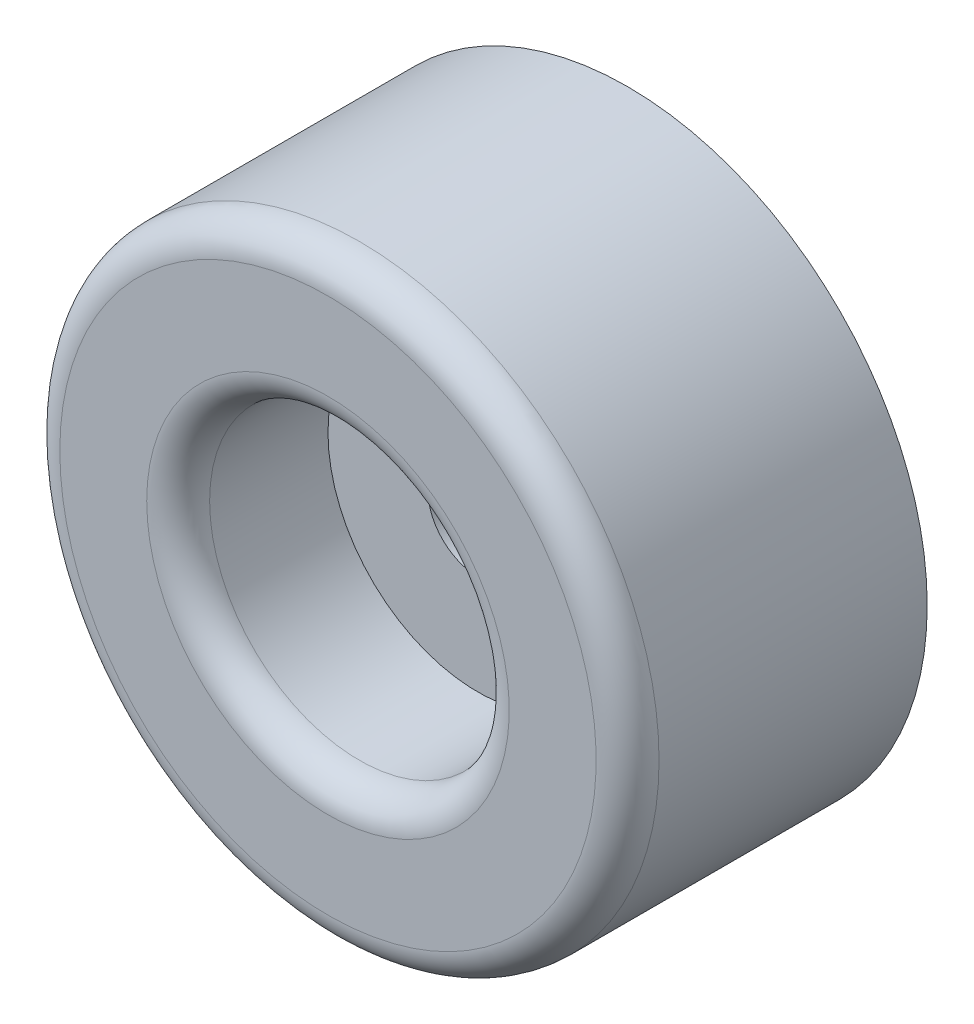
ISO-10303-21;
HEADER;
FILE_DESCRIPTION(('STEP AP214'),'2;1');
FILE_NAME('part.step','',(''),(''),'','','');
FILE_SCHEMA(('AUTOMOTIVE_DESIGN { 1 0 10303 214 1 1 1 1 }'));
ENDSEC;
DATA;
#1=APPLICATION_CONTEXT('core data for automotive mechanical design processes');
#2=APPLICATION_PROTOCOL_DEFINITION('international standard','automotive_design',2000,#1);
#3=PRODUCT_CONTEXT('',#1,'mechanical');
#4=PRODUCT('Part','Part','',(#3));
#5=PRODUCT_RELATED_PRODUCT_CATEGORY('part','',(#4));
#6=PRODUCT_DEFINITION_FORMATION('','',#4);
#7=PRODUCT_DEFINITION_CONTEXT('part definition',#1,'design');
#8=PRODUCT_DEFINITION('design','',#6,#7);
#9=PRODUCT_DEFINITION_SHAPE('','',#8);
#10=(LENGTH_UNIT() NAMED_UNIT(*) SI_UNIT(.MILLI.,.METRE.));
#11=(NAMED_UNIT(*) PLANE_ANGLE_UNIT() SI_UNIT($,.RADIAN.));
#12=(NAMED_UNIT(*) SI_UNIT($,.STERADIAN.) SOLID_ANGLE_UNIT());
#13=UNCERTAINTY_MEASURE_WITH_UNIT(LENGTH_MEASURE(1.E-05),#10,'distance_accuracy_value','');
#14=(GEOMETRIC_REPRESENTATION_CONTEXT(3) GLOBAL_UNCERTAINTY_ASSIGNED_CONTEXT((#13)) GLOBAL_UNIT_ASSIGNED_CONTEXT((#10,
#11,#12)) REPRESENTATION_CONTEXT('',''));
#15=CARTESIAN_POINT('',(0.,0.,0.));
#16=DIRECTION('',(0.,0.,1.));
#17=DIRECTION('',(1.,0.,0.));
#18=AXIS2_PLACEMENT_3D('',#15,#16,#17);
#19=CARTESIAN_POINT('',(0.,0.,13.1472968453585));
#20=DIRECTION('',(0.,0.,1.));
#21=DIRECTION('',(1.00000000000005,0.,0.));
#22=AXIS2_PLACEMENT_3D('',#19,#20,#21);
#23=CYLINDRICAL_SURFACE('',#22,19.05);
#24=CARTESIAN_POINT('',(0.,0.,17.0499999999997));
#25=DIRECTION('',(0.,0.,-1.));
#26=DIRECTION('',(-1.00000000000005,0.,0.));
#27=AXIS2_PLACEMENT_3D('',#24,#25,#26);
#28=CIRCLE('',#27,19.05);
#29=CARTESIAN_POINT('',(19.050000000001,-3.07803990858155E-13,17.0499999999997));
#30=VERTEX_POINT('',#29);
#31=EDGE_CURVE('E12',#30,#30,#28,.T.);
#32=CARTESIAN_POINT('',(0.,0.,0.));
#33=DIRECTION('',(0.,0.,1.));
#34=DIRECTION('',(1.00000000000005,0.,0.));
#35=AXIS2_PLACEMENT_3D('',#32,#33,#34);
#36=CIRCLE('',#35,19.05);
#37=CARTESIAN_POINT('',(19.050000000001,-3.02855768816391E-13,0.));
#38=VERTEX_POINT('',#37);
#39=EDGE_CURVE('E77',#38,#38,#36,.T.);
#40=CARTESIAN_POINT('',(19.050000000001,-3.07803990858155E-13,17.0499999999997));
#41=CARTESIAN_POINT('',(19.050000000001,-3.07752446878553E-13,16.872395833333));
#42=CARTESIAN_POINT('',(19.050000000001,-3.07700902898951E-13,16.6947916666664));
#43=CARTESIAN_POINT('',(19.050000000001,-3.07597814939748E-13,16.339583333333));
#44=CARTESIAN_POINT('',(19.050000000001,-3.07546270960146E-13,16.1619791666664));
#45=CARTESIAN_POINT('',(19.050000000001,-3.07443183000943E-13,15.806770833333));
#46=CARTESIAN_POINT('',(19.050000000001,-3.07391639021341E-13,15.6291666666664));
#47=CARTESIAN_POINT('',(19.050000000001,-3.07288551062137E-13,15.273958333333));
#48=CARTESIAN_POINT('',(19.050000000001,-3.07237007082536E-13,15.0963541666664));
#49=CARTESIAN_POINT('',(19.050000000001,-3.07133919123332E-13,14.7411458333331));
#50=CARTESIAN_POINT('',(19.050000000001,-3.07082375143731E-13,14.5635416666664));
#51=CARTESIAN_POINT('',(19.050000000001,-3.06979287184527E-13,14.2083333333331));
#52=CARTESIAN_POINT('',(19.050000000001,-3.06927743204926E-13,14.0307291666664));
#53=CARTESIAN_POINT('',(19.050000000001,-3.06824655245722E-13,13.6755208333331));
#54=CARTESIAN_POINT('',(19.050000000001,-3.0677311126612E-13,13.4979166666664));
#55=CARTESIAN_POINT('',(19.050000000001,-3.06670023306917E-13,13.1427083333331));
#56=CARTESIAN_POINT('',(19.050000000001,-3.06618479327315E-13,12.9651041666664));
#57=CARTESIAN_POINT('',(19.050000000001,-3.06515391368112E-13,12.6098958333331));
#58=CARTESIAN_POINT('',(19.050000000001,-3.0646384738851E-13,12.4322916666664));
#59=CARTESIAN_POINT('',(19.050000000001,-3.06360759429307E-13,12.0770833333331));
#60=CARTESIAN_POINT('',(19.050000000001,-3.06309215449705E-13,11.8994791666664));
#61=CARTESIAN_POINT('',(19.050000000001,-3.06206127490502E-13,11.5442708333331));
#62=CARTESIAN_POINT('',(19.050000000001,-3.061545835109E-13,11.3666666666665));
#63=CARTESIAN_POINT('',(19.050000000001,-3.06051495551697E-13,11.0114583333331));
#64=CARTESIAN_POINT('',(19.050000000001,-3.05999951572095E-13,10.8338541666665));
#65=CARTESIAN_POINT('',(19.050000000001,-3.05896863612891E-13,10.4786458333331));
#66=CARTESIAN_POINT('',(19.050000000001,-3.0584531963329E-13,10.3010416666665));
#67=CARTESIAN_POINT('',(19.050000000001,-3.05742231674086E-13,9.94583333333315));
#68=CARTESIAN_POINT('',(19.050000000001,-3.05690687694485E-13,9.76822916666648));
#69=CARTESIAN_POINT('',(19.050000000001,-3.05587599735281E-13,9.41302083333316));
#70=CARTESIAN_POINT('',(19.050000000001,-3.0553605575568E-13,9.2354166666665));
#71=CARTESIAN_POINT('',(19.050000000001,-3.05432967796476E-13,8.88020833333317));
#72=CARTESIAN_POINT('',(19.050000000001,-3.05381423816874E-13,8.7026041666665));
#73=CARTESIAN_POINT('',(19.050000000001,-3.05278335857671E-13,8.34739583333318));
#74=CARTESIAN_POINT('',(19.050000000001,-3.05226791878069E-13,8.16979166666651));
#75=CARTESIAN_POINT('',(19.050000000001,-3.05123703918866E-13,7.81458333333319));
#76=CARTESIAN_POINT('',(19.050000000001,-3.05072159939264E-13,7.63697916666653));
#77=CARTESIAN_POINT('',(19.050000000001,-3.04969071980061E-13,7.2817708333332));
#78=CARTESIAN_POINT('',(19.050000000001,-3.04917528000459E-13,7.10416666666654));
#79=CARTESIAN_POINT('',(19.050000000001,-3.04814440041256E-13,6.74895833333321));
#80=CARTESIAN_POINT('',(19.050000000001,-3.04762896061654E-13,6.57135416666655));
#81=CARTESIAN_POINT('',(19.050000000001,-3.04659808102451E-13,6.21614583333322));
#82=CARTESIAN_POINT('',(19.050000000001,-3.04608264122849E-13,6.03854166666656));
#83=CARTESIAN_POINT('',(19.050000000001,-3.04505176163646E-13,5.68333333333323));
#84=CARTESIAN_POINT('',(19.050000000001,-3.04453632184044E-13,5.50572916666657));
#85=CARTESIAN_POINT('',(19.050000000001,-3.0435054422484E-13,5.15052083333324));
#86=CARTESIAN_POINT('',(19.050000000001,-3.04299000245239E-13,4.97291666666658));
#87=CARTESIAN_POINT('',(19.050000000001,-3.04195912286035E-13,4.61770833333325));
#88=CARTESIAN_POINT('',(19.050000000001,-3.04144368306434E-13,4.44010416666659));
#89=CARTESIAN_POINT('',(19.050000000001,-3.0404128034723E-13,4.08489583333326));
#90=CARTESIAN_POINT('',(19.050000000001,-3.03989736367629E-13,3.9072916666666));
#91=CARTESIAN_POINT('',(19.050000000001,-3.03886648408425E-13,3.55208333333327));
#92=CARTESIAN_POINT('',(19.050000000001,-3.03835104428823E-13,3.37447916666661));
#93=CARTESIAN_POINT('',(19.050000000001,-3.0373201646962E-13,3.01927083333328));
#94=CARTESIAN_POINT('',(19.050000000001,-3.03680472490018E-13,2.84166666666662));
#95=CARTESIAN_POINT('',(19.050000000001,-3.03577384530815E-13,2.48645833333329));
#96=CARTESIAN_POINT('',(19.050000000001,-3.03525840551213E-13,2.30885416666663));
#97=CARTESIAN_POINT('',(19.050000000001,-3.0342275259201E-13,1.9536458333333));
#98=CARTESIAN_POINT('',(19.050000000001,-3.03371208612408E-13,1.77604166666664));
#99=CARTESIAN_POINT('',(19.050000000001,-3.03268120653205E-13,1.42083333333331));
#100=CARTESIAN_POINT('',(19.050000000001,-3.03216576673603E-13,1.24322916666665));
#101=CARTESIAN_POINT('',(19.050000000001,-3.031134887144E-13,0.888020833333323));
#102=CARTESIAN_POINT('',(19.050000000001,-3.03061944734798E-13,0.71041666666666));
#103=CARTESIAN_POINT('',(19.050000000001,-3.02958856775595E-13,0.355208333333334));
#104=CARTESIAN_POINT('',(19.050000000001,-3.02907312795993E-13,0.17760416666667));
#105=CARTESIAN_POINT('',(19.050000000001,-3.02855768816391E-13,0.));
#106=B_SPLINE_CURVE_WITH_KNOTS('',3,(#40,#41,#42,#43,#44,#45,#46,#47,#48,#49,#50,#51,#52,#53,
#54,#55,#56,#57,#58,#59,#60,#61,#62,#63,#64,#65,#66,#67,#68,#69,#70,#71,#72,#73,#74,#75,#76,#77,
#78,#79,#80,#81,#82,#83,#84,#85,#86,#87,#88,#89,#90,#91,#92,#93,#94,#95,#96,#97,#98,#99,#100,
#101,#102,#103,#104,#105),.UNSPECIFIED.,.F.,.F.,(4,2,2,2,2,2,2,2,2,2,2,2,2,2,2,2,2,2,2,2,2,2,2,
2,2,2,2,2,2,2,2,2,4),(0.,0.532812499999986,1.06562499999998,1.59843749999997,2.13124999999996,
2.66406249999995,3.19687499999994,3.72968749999993,4.26249999999992,4.79531249999991,
5.3281249999999,5.86093749999988,6.39374999999988,6.92656249999987,7.45937499999985,
7.99218749999984,8.52499999999984,9.05781249999982,9.59062499999981,10.1234374999998,
10.6562499999998,11.1890624999998,11.7218749999998,12.2546874999998,12.7874999999998,
13.3203124999997,13.8531249999997,14.3859374999997,14.9187499999997,15.4515624999997,
15.9843749999997,16.5171874999997,17.0499999999997),.UNSPECIFIED.);
#107=EDGE_CURVE('BSEAM48',#30,#38,#106,.T.);
#108=ORIENTED_EDGE('',*,*,#31,.T.);
#109=ORIENTED_EDGE('',*,*,#39,.T.);
#110=ORIENTED_EDGE('',*,*,#107,.T.);
#111=ORIENTED_EDGE('',*,*,#107,.F.);
#112=EDGE_LOOP('',(#108,#110,#109,#111));
#113=FACE_BOUND('',#112,.T.);
#114=ADVANCED_FACE('F48',(#113),#23,.T.);
#115=CARTESIAN_POINT('',(0.,19.0500000000001,19.0499999999999));
#116=DIRECTION('',(0.,0.,-1.));
#117=DIRECTION('',(-1.00000000000005,0.,0.));
#118=AXIS2_PLACEMENT_3D('',#115,#116,#117);
#119=PLANE('',#118);
#120=CARTESIAN_POINT('',(0.,0.,19.0499999999999));
#121=DIRECTION('',(0.,0.,-1.));
#122=DIRECTION('',(-1.00000000000005,0.,0.));
#123=AXIS2_PLACEMENT_3D('',#120,#121,#122);
#124=CIRCLE('',#123,11.525);
#125=CARTESIAN_POINT('',(-11.5250000000006,1.85532145202671E-13,19.0499999999999));
#126=VERTEX_POINT('',#125);
#127=EDGE_CURVE('E55',#126,#126,#124,.T.);
#128=ORIENTED_EDGE('',*,*,#127,.T.);
#129=EDGE_LOOP('',(#128));
#130=FACE_BOUND('',#129,.T.);
#131=CARTESIAN_POINT('',(0.,0.,19.0499999999999));
#132=DIRECTION('',(0.,0.,-1.));
#133=DIRECTION('',(-1.00000000000005,0.,0.));
#134=AXIS2_PLACEMENT_3D('',#131,#132,#133);
#135=CIRCLE('',#134,17.05);
#136=CARTESIAN_POINT('',(-17.0500000000009,2.74474887262954E-13,19.0499999999999));
#137=VERTEX_POINT('',#136);
#138=EDGE_CURVE('E59',#137,#137,#135,.F.);
#139=ORIENTED_EDGE('',*,*,#138,.T.);
#140=EDGE_LOOP('',(#139));
#141=FACE_BOUND('',#140,.T.);
#142=ADVANCED_FACE('F103',(#130,#141),#119,.F.);
#143=CARTESIAN_POINT('',(0.,0.,13.1472968453585));
#144=DIRECTION('',(0.,0.,1.));
#145=DIRECTION('',(1.00000000000005,0.,0.));
#146=AXIS2_PLACEMENT_3D('',#143,#144,#145);
#147=CYLINDRICAL_SURFACE('',#146,9.525);
#148=CARTESIAN_POINT('',(0.,0.,17.0499999999997));
#149=DIRECTION('',(0.,0.,-1.));
#150=DIRECTION('',(-1.00000000000005,0.,0.));
#151=AXIS2_PLACEMENT_3D('',#148,#149,#150);
#152=CIRCLE('',#151,9.525);
#153=CARTESIAN_POINT('',(9.5250000000005,-1.54468313369613E-13,17.0499999999997));
#154=VERTEX_POINT('',#153);
#155=EDGE_CURVE('E63',#154,#154,#152,.F.);
#156=CARTESIAN_POINT('',(0.,0.,9.52500000000001));
#157=DIRECTION('',(0.,0.,1.));
#158=DIRECTION('',(1.00000000000005,0.,0.));
#159=AXIS2_PLACEMENT_3D('',#156,#157,#158);
#160=CIRCLE('',#159,9.525);
#161=CARTESIAN_POINT('',(9.5250000000005,-1.52284420650301E-13,9.52500000000001));
#162=VERTEX_POINT('',#161);
#163=EDGE_CURVE('E68',#162,#162,#160,.T.);
#164=CARTESIAN_POINT('',(9.5250000000005,-1.54468313369613E-13,17.0499999999997));
#165=CARTESIAN_POINT('',(9.5250000000005,-1.5444556448712E-13,16.971614583333));
#166=CARTESIAN_POINT('',(9.5250000000005,-1.54422815604627E-13,16.8932291666663));
#167=CARTESIAN_POINT('',(9.5250000000005,-1.54377317839641E-13,16.736458333333));
#168=CARTESIAN_POINT('',(9.5250000000005,-1.54354568957148E-13,16.6580729166664));
#169=CARTESIAN_POINT('',(9.5250000000005,-1.54309071192163E-13,16.501302083333));
#170=CARTESIAN_POINT('',(9.5250000000005,-1.5428632230967E-13,16.4229166666664));
#171=CARTESIAN_POINT('',(9.5250000000005,-1.54240824544684E-13,16.266145833333));
#172=CARTESIAN_POINT('',(9.5250000000005,-1.54218075662191E-13,16.1877604166664));
#173=CARTESIAN_POINT('',(9.5250000000005,-1.54172577897206E-13,16.0309895833331));
#174=CARTESIAN_POINT('',(9.5250000000005,-1.54149829014713E-13,15.9526041666664));
#175=CARTESIAN_POINT('',(9.5250000000005,-1.54104331249727E-13,15.7958333333331));
#176=CARTESIAN_POINT('',(9.5250000000005,-1.54081582367234E-13,15.7174479166664));
#177=CARTESIAN_POINT('',(9.5250000000005,-1.54036084602249E-13,15.5606770833331));
#178=CARTESIAN_POINT('',(9.5250000000005,-1.54013335719756E-13,15.4822916666664));
#179=CARTESIAN_POINT('',(9.5250000000005,-1.5396783795477E-13,15.3255208333331));
#180=CARTESIAN_POINT('',(9.5250000000005,-1.53945089072277E-13,15.2471354166664));
#181=CARTESIAN_POINT('',(9.5250000000005,-1.53899591307292E-13,15.0903645833331));
#182=CARTESIAN_POINT('',(9.5250000000005,-1.53876842424799E-13,15.0119791666664));
#183=CARTESIAN_POINT('',(9.5250000000005,-1.53831344659813E-13,14.8552083333331));
#184=CARTESIAN_POINT('',(9.5250000000005,-1.5380859577732E-13,14.7768229166664));
#185=CARTESIAN_POINT('',(9.5250000000005,-1.53763098012335E-13,14.6200520833331));
#186=CARTESIAN_POINT('',(9.5250000000005,-1.53740349129842E-13,14.5416666666665));
#187=CARTESIAN_POINT('',(9.5250000000005,-1.53694851364856E-13,14.3848958333331));
#188=CARTESIAN_POINT('',(9.5250000000005,-1.53672102482363E-13,14.3065104166665));
#189=CARTESIAN_POINT('',(9.5250000000005,-1.53626604717378E-13,14.1497395833331));
#190=CARTESIAN_POINT('',(9.5250000000005,-1.53603855834885E-13,14.0713541666665));
#191=CARTESIAN_POINT('',(9.5250000000005,-1.53558358069899E-13,13.9145833333331));
#192=CARTESIAN_POINT('',(9.5250000000005,-1.53535609187406E-13,13.8361979166665));
#193=CARTESIAN_POINT('',(9.5250000000005,-1.53490111422421E-13,13.6794270833332));
#194=CARTESIAN_POINT('',(9.5250000000005,-1.53467362539928E-13,13.6010416666665));
#195=CARTESIAN_POINT('',(9.5250000000005,-1.53421864774942E-13,13.4442708333332));
#196=CARTESIAN_POINT('',(9.5250000000005,-1.53399115892449E-13,13.3658854166665));
#197=CARTESIAN_POINT('',(9.5250000000005,-1.53353618127464E-13,13.2091145833332));
#198=CARTESIAN_POINT('',(9.5250000000005,-1.53330869244971E-13,13.1307291666665));
#199=CARTESIAN_POINT('',(9.5250000000005,-1.53285371479985E-13,12.9739583333332));
#200=CARTESIAN_POINT('',(9.5250000000005,-1.53262622597493E-13,12.8955729166665));
#201=CARTESIAN_POINT('',(9.5250000000005,-1.53217124832507E-13,12.7388020833332));
#202=CARTESIAN_POINT('',(9.5250000000005,-1.53194375950014E-13,12.6604166666665));
#203=CARTESIAN_POINT('',(9.5250000000005,-1.53148878185028E-13,12.5036458333332));
#204=CARTESIAN_POINT('',(9.5250000000005,-1.53126129302536E-13,12.4252604166665));
#205=CARTESIAN_POINT('',(9.5250000000005,-1.5308063153755E-13,12.2684895833332));
#206=CARTESIAN_POINT('',(9.5250000000005,-1.53057882655057E-13,12.1901041666666));
#207=CARTESIAN_POINT('',(9.5250000000005,-1.53012384890071E-13,12.0333333333332));
#208=CARTESIAN_POINT('',(9.5250000000005,-1.52989636007579E-13,11.9549479166666));
#209=CARTESIAN_POINT('',(9.5250000000005,-1.52944138242593E-13,11.7981770833332));
#210=CARTESIAN_POINT('',(9.5250000000005,-1.529213893601E-13,11.7197916666666));
#211=CARTESIAN_POINT('',(9.5250000000005,-1.52875891595114E-13,11.5630208333333));
#212=CARTESIAN_POINT('',(9.5250000000005,-1.52853142712622E-13,11.4846354166666));
#213=CARTESIAN_POINT('',(9.5250000000005,-1.52807644947636E-13,11.3278645833333));
#214=CARTESIAN_POINT('',(9.5250000000005,-1.52784896065143E-13,11.2494791666666));
#215=CARTESIAN_POINT('',(9.5250000000005,-1.52739398300157E-13,11.0927083333333));
#216=CARTESIAN_POINT('',(9.5250000000005,-1.52716649417665E-13,11.0143229166666));
#217=CARTESIAN_POINT('',(9.5250000000005,-1.52671151652679E-13,10.8575520833333));
#218=CARTESIAN_POINT('',(9.5250000000005,-1.52648402770186E-13,10.7791666666666));
#219=CARTESIAN_POINT('',(9.5250000000005,-1.526029050052E-13,10.6223958333333));
#220=CARTESIAN_POINT('',(9.5250000000005,-1.52580156122708E-13,10.5440104166666));
#221=CARTESIAN_POINT('',(9.5250000000005,-1.52534658357722E-13,10.3872395833333));
#222=CARTESIAN_POINT('',(9.5250000000005,-1.52511909475229E-13,10.3088541666666));
#223=CARTESIAN_POINT('',(9.5250000000005,-1.52466411710243E-13,10.1520833333333));
#224=CARTESIAN_POINT('',(9.5250000000005,-1.52443662827751E-13,10.0736979166667));
#225=CARTESIAN_POINT('',(9.5250000000005,-1.52398165062765E-13,9.91692708333333));
#226=CARTESIAN_POINT('',(9.5250000000005,-1.52375416180272E-13,9.83854166666666));
#227=CARTESIAN_POINT('',(9.5250000000005,-1.52329918415286E-13,9.68177083333333));
#228=CARTESIAN_POINT('',(9.5250000000005,-1.52307169532794E-13,9.60338541666667));
#229=CARTESIAN_POINT('',(9.5250000000005,-1.52284420650301E-13,9.52500000000001));
#230=B_SPLINE_CURVE_WITH_KNOTS('',3,(#164,#165,#166,#167,#168,#169,#170,#171,#172,#173,#174,
#175,#176,#177,#178,#179,#180,#181,#182,#183,#184,#185,#186,#187,#188,#189,#190,#191,#192,#193,
#194,#195,#196,#197,#198,#199,#200,#201,#202,#203,#204,#205,#206,#207,#208,#209,#210,#211,#212,
#213,#214,#215,#216,#217,#218,#219,#220,#221,#222,#223,#224,#225,#226,#227,#228,#229),
.UNSPECIFIED.,.F.,.F.,(4,2,2,2,2,2,2,2,2,2,2,2,2,2,2,2,2,2,2,2,2,2,2,2,2,2,2,2,2,2,2,2,4),(0.,
0.235156249999993,0.470312499999979,0.705468749999969,0.940624999999959,1.17578124999995,
1.41093749999994,1.64609374999993,1.88124999999992,2.11640624999991,2.3515624999999,
2.58671874999989,2.82187499999988,3.05703124999987,3.29218749999986,3.52734374999984,
3.76249999999983,3.99765624999982,4.23281249999981,4.4679687499998,4.70312499999979,
4.93828124999978,5.17343749999977,5.40859374999976,5.64374999999975,5.87890624999974,
6.11406249999973,6.34921874999972,6.58437499999971,6.8195312499997,7.05468749999969,
7.28984374999968,7.52499999999967),.UNSPECIFIED.);
#231=EDGE_CURVE('BSEAM98',#154,#162,#230,.T.);
#232=ORIENTED_EDGE('',*,*,#155,.T.);
#233=ORIENTED_EDGE('',*,*,#163,.F.);
#234=ORIENTED_EDGE('',*,*,#231,.T.);
#235=ORIENTED_EDGE('',*,*,#231,.F.);
#236=EDGE_LOOP('',(#232,#234,#233,#235));
#237=FACE_BOUND('',#236,.T.);
#238=ADVANCED_FACE('F98',(#237),#147,.F.);
#239=CARTESIAN_POINT('',(-1.11022302462516E-13,9.52500000000006,9.52499999999989));
#240=DIRECTION('',(0.,0.,-1.));
#241=DIRECTION('',(-1.00000000000005,0.,0.));
#242=AXIS2_PLACEMENT_3D('',#239,#240,#241);
#243=PLANE('',#242);
#244=CARTESIAN_POINT('',(0.,0.,9.52500000000001));
#245=DIRECTION('',(0.,0.,1.));
#246=DIRECTION('',(1.00000000000005,0.,0.));
#247=AXIS2_PLACEMENT_3D('',#244,#245,#246);
#248=CIRCLE('',#247,3.175);
#249=CARTESIAN_POINT('',(3.17500000000017,0.,9.52500000000001));
#250=VERTEX_POINT('',#249);
#251=EDGE_CURVE('E71',#250,#250,#248,.T.);
#252=ORIENTED_EDGE('',*,*,#251,.F.);
#253=EDGE_LOOP('',(#252));
#254=FACE_BOUND('',#253,.T.);
#255=ORIENTED_EDGE('',*,*,#163,.T.);
#256=EDGE_LOOP('',(#255));
#257=FACE_BOUND('',#256,.T.);
#258=ADVANCED_FACE('F92',(#254,#257),#243,.F.);
#259=CARTESIAN_POINT('',(0.,0.,13.1472968453585));
#260=DIRECTION('',(0.,0.,1.));
#261=DIRECTION('',(1.00000000000005,0.,0.));
#262=AXIS2_PLACEMENT_3D('',#259,#260,#261);
#263=CYLINDRICAL_SURFACE('',#262,3.175);
#264=CARTESIAN_POINT('',(0.,0.,0.));
#265=DIRECTION('',(0.,0.,1.));
#266=DIRECTION('',(1.00000000000005,0.,0.));
#267=AXIS2_PLACEMENT_3D('',#264,#265,#266);
#268=CIRCLE('',#267,3.175);
#269=CARTESIAN_POINT('',(3.17500000000017,0.,0.));
#270=VERTEX_POINT('',#269);
#271=EDGE_CURVE('E74',#270,#270,#268,.T.);
#272=CARTESIAN_POINT('',(3.17500000000017,0.,0.));
#273=CARTESIAN_POINT('',(3.17500000000017,0.,0.0992187500000018));
#274=CARTESIAN_POINT('',(3.17500000000017,0.,0.198437500000002));
#275=CARTESIAN_POINT('',(3.17500000000017,0.,0.396875000000002));
#276=CARTESIAN_POINT('',(3.17500000000017,0.,0.496093750000002));
#277=CARTESIAN_POINT('',(3.17500000000017,0.,0.694531250000002));
#278=CARTESIAN_POINT('',(3.17500000000017,0.,0.793750000000002));
#279=CARTESIAN_POINT('',(3.17500000000017,0.,0.992187500000002));
#280=CARTESIAN_POINT('',(3.17500000000017,0.,1.09140625));
#281=CARTESIAN_POINT('',(3.17500000000017,0.,1.28984375));
#282=CARTESIAN_POINT('',(3.17500000000017,0.,1.3890625));
#283=CARTESIAN_POINT('',(3.17500000000017,0.,1.5875));
#284=CARTESIAN_POINT('',(3.17500000000017,0.,1.68671875));
#285=CARTESIAN_POINT('',(3.17500000000017,0.,1.88515625));
#286=CARTESIAN_POINT('',(3.17500000000017,0.,1.984375));
#287=CARTESIAN_POINT('',(3.17500000000017,0.,2.1828125));
#288=CARTESIAN_POINT('',(3.17500000000017,0.,2.28203125));
#289=CARTESIAN_POINT('',(3.17500000000017,0.,2.48046875));
#290=CARTESIAN_POINT('',(3.17500000000017,0.,2.5796875));
#291=CARTESIAN_POINT('',(3.17500000000017,0.,2.778125));
#292=CARTESIAN_POINT('',(3.17500000000017,0.,2.87734375));
#293=CARTESIAN_POINT('',(3.17500000000017,0.,3.07578125));
#294=CARTESIAN_POINT('',(3.17500000000017,0.,3.175));
#295=CARTESIAN_POINT('',(3.17500000000017,0.,3.3734375));
#296=CARTESIAN_POINT('',(3.17500000000017,0.,3.47265625));
#297=CARTESIAN_POINT('',(3.17500000000017,0.,3.67109375));
#298=CARTESIAN_POINT('',(3.17500000000017,0.,3.7703125));
#299=CARTESIAN_POINT('',(3.17500000000017,0.,3.96875));
#300=CARTESIAN_POINT('',(3.17500000000017,0.,4.06796875));
#301=CARTESIAN_POINT('',(3.17500000000017,0.,4.26640625));
#302=CARTESIAN_POINT('',(3.17500000000017,0.,4.365625));
#303=CARTESIAN_POINT('',(3.17500000000017,0.,4.5640625));
#304=CARTESIAN_POINT('',(3.17500000000017,0.,4.66328125));
#305=CARTESIAN_POINT('',(3.17500000000017,0.,4.86171875));
#306=CARTESIAN_POINT('',(3.17500000000017,0.,4.9609375));
#307=CARTESIAN_POINT('',(3.17500000000017,0.,5.159375));
#308=CARTESIAN_POINT('',(3.17500000000017,0.,5.25859375));
#309=CARTESIAN_POINT('',(3.17500000000017,0.,5.45703125));
#310=CARTESIAN_POINT('',(3.17500000000017,0.,5.55625));
#311=CARTESIAN_POINT('',(3.17500000000017,0.,5.7546875));
#312=CARTESIAN_POINT('',(3.17500000000017,0.,5.85390625));
#313=CARTESIAN_POINT('',(3.17500000000017,0.,6.05234375));
#314=CARTESIAN_POINT('',(3.17500000000017,0.,6.1515625));
#315=CARTESIAN_POINT('',(3.17500000000017,0.,6.35));
#316=CARTESIAN_POINT('',(3.17500000000017,0.,6.44921875));
#317=CARTESIAN_POINT('',(3.17500000000017,0.,6.64765625000001));
#318=CARTESIAN_POINT('',(3.17500000000017,0.,6.746875));
#319=CARTESIAN_POINT('',(3.17500000000017,0.,6.94531250000001));
#320=CARTESIAN_POINT('',(3.17500000000017,0.,7.04453125000001));
#321=CARTESIAN_POINT('',(3.17500000000017,0.,7.24296875000001));
#322=CARTESIAN_POINT('',(3.17500000000017,0.,7.34218750000001));
#323=CARTESIAN_POINT('',(3.17500000000017,0.,7.54062500000001));
#324=CARTESIAN_POINT('',(3.17500000000017,0.,7.63984375000001));
#325=CARTESIAN_POINT('',(3.17500000000017,0.,7.83828125000001));
#326=CARTESIAN_POINT('',(3.17500000000017,0.,7.93750000000001));
#327=CARTESIAN_POINT('',(3.17500000000017,0.,8.1359375));
#328=CARTESIAN_POINT('',(3.17500000000017,0.,8.23515625));
#329=CARTESIAN_POINT('',(3.17500000000017,0.,8.43359375000001));
#330=CARTESIAN_POINT('',(3.17500000000017,0.,8.53281250000001));
#331=CARTESIAN_POINT('',(3.17500000000017,0.,8.73125));
#332=CARTESIAN_POINT('',(3.17500000000017,0.,8.83046875));
#333=CARTESIAN_POINT('',(3.17500000000017,0.,9.02890625000001));
#334=CARTESIAN_POINT('',(3.17500000000017,0.,9.12812500000001));
#335=CARTESIAN_POINT('',(3.17500000000017,0.,9.3265625));
#336=CARTESIAN_POINT('',(3.17500000000017,0.,9.42578125000001));
#337=CARTESIAN_POINT('',(3.17500000000017,0.,9.52500000000001));
#338=B_SPLINE_CURVE_WITH_KNOTS('',3,(#272,#273,#274,#275,#276,#277,#278,#279,#280,#281,#282,
#283,#284,#285,#286,#287,#288,#289,#290,#291,#292,#293,#294,#295,#296,#297,#298,#299,#300,#301,
#302,#303,#304,#305,#306,#307,#308,#309,#310,#311,#312,#313,#314,#315,#316,#317,#318,#319,#320,
#321,#322,#323,#324,#325,#326,#327,#328,#329,#330,#331,#332,#333,#334,#335,#336,#337),
.UNSPECIFIED.,.F.,.F.,(4,2,2,2,2,2,2,2,2,2,2,2,2,2,2,2,2,2,2,2,2,2,2,2,2,2,2,2,2,2,2,2,4),(0.,
0.29765625,0.5953125,0.892968750000001,1.190625,1.48828125,1.7859375,2.08359375,2.38125,
2.67890625,2.9765625,3.27421875,3.571875,3.86953125,4.1671875,4.46484375,4.7625,5.06015625,
5.3578125,5.65546875,5.953125,6.25078125,6.5484375,6.84609375,7.14375,7.44140625,7.7390625,
8.03671875,8.334375,8.63203125,8.9296875,9.22734375,9.525),.UNSPECIFIED.);
#339=EDGE_CURVE('BSEAM86',#270,#250,#338,.T.);
#340=ORIENTED_EDGE('',*,*,#271,.F.);
#341=ORIENTED_EDGE('',*,*,#251,.T.);
#342=ORIENTED_EDGE('',*,*,#339,.T.);
#343=ORIENTED_EDGE('',*,*,#339,.F.);
#344=EDGE_LOOP('',(#340,#342,#341,#343));
#345=FACE_BOUND('',#344,.T.);
#346=ADVANCED_FACE('F86',(#345),#263,.F.);
#347=CARTESIAN_POINT('',(-2.22044604925031E-13,3.17500000000021,1.14491749414469E-13));
#348=DIRECTION('',(0.,0.,1.));
#349=DIRECTION('',(1.00000000000005,0.,0.));
#350=AXIS2_PLACEMENT_3D('',#347,#348,#349);
#351=PLANE('',#350);
#352=ORIENTED_EDGE('',*,*,#39,.F.);
#353=EDGE_LOOP('',(#352));
#354=FACE_BOUND('',#353,.T.);
#355=ORIENTED_EDGE('',*,*,#271,.T.);
#356=EDGE_LOOP('',(#355));
#357=FACE_BOUND('',#356,.T.);
#358=ADVANCED_FACE('F82',(#354,#357),#351,.F.);
#359=CARTESIAN_POINT('',(0.,0.,17.0499999999997));
#360=DIRECTION('',(0.,0.,-1.));
#361=DIRECTION('',(-1.00000000000005,0.,0.));
#362=AXIS2_PLACEMENT_3D('',#359,#360,#361);
#363=TOROIDAL_SURFACE('',#362,11.525,2.);
#364=ORIENTED_EDGE('',*,*,#127,.F.);
#365=EDGE_LOOP('',(#364));
#366=FACE_BOUND('',#365,.T.);
#367=ORIENTED_EDGE('',*,*,#155,.F.);
#368=EDGE_LOOP('',(#367));
#369=FACE_BOUND('',#368,.T.);
#370=ADVANCED_FACE('F85',(#366,#369),#363,.T.);
#371=CARTESIAN_POINT('',(0.,0.,17.0499999999997));
#372=DIRECTION('',(0.,0.,-1.));
#373=DIRECTION('',(-1.00000000000005,0.,0.));
#374=AXIS2_PLACEMENT_3D('',#371,#372,#373);
#375=TOROIDAL_SURFACE('',#374,17.05,2.);
#376=ORIENTED_EDGE('',*,*,#31,.F.);
#377=EDGE_LOOP('',(#376));
#378=FACE_BOUND('',#377,.T.);
#379=ORIENTED_EDGE('',*,*,#138,.F.);
#380=EDGE_LOOP('',(#379));
#381=FACE_BOUND('',#380,.T.);
#382=ADVANCED_FACE('F50',(#378,#381),#375,.T.);
#383=CLOSED_SHELL('',(#114,#142,#238,#258,#346,#358,#370,#382));
#384=MANIFOLD_SOLID_BREP('B2',#383);
#385=ADVANCED_BREP_SHAPE_REPRESENTATION('',(#18,#384),#14);
#386=SHAPE_DEFINITION_REPRESENTATION(#9,#385);
ENDSEC;
END-ISO-10303-21;
